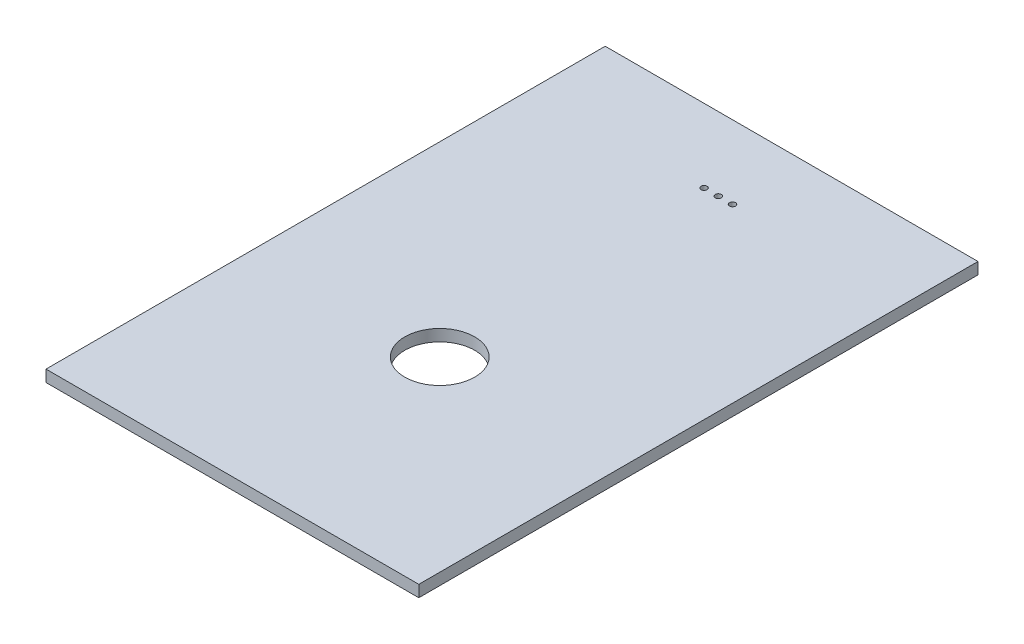
ISO-10303-21;
HEADER;
FILE_DESCRIPTION(('STEP AP214'),'2;1');
FILE_NAME('part.step','',(''),(''),'','','');
FILE_SCHEMA(('AUTOMOTIVE_DESIGN { 1 0 10303 214 1 1 1 1 }'));
ENDSEC;
DATA;
#1=APPLICATION_CONTEXT('core data for automotive mechanical design processes');
#2=APPLICATION_PROTOCOL_DEFINITION('international standard','automotive_design',2000,#1);
#3=PRODUCT_CONTEXT('',#1,'mechanical');
#4=PRODUCT('Part','Part','',(#3));
#5=PRODUCT_RELATED_PRODUCT_CATEGORY('part','',(#4));
#6=PRODUCT_DEFINITION_FORMATION('','',#4);
#7=PRODUCT_DEFINITION_CONTEXT('part definition',#1,'design');
#8=PRODUCT_DEFINITION('design','',#6,#7);
#9=PRODUCT_DEFINITION_SHAPE('','',#8);
#10=(LENGTH_UNIT() NAMED_UNIT(*) SI_UNIT(.MILLI.,.METRE.));
#11=(NAMED_UNIT(*) PLANE_ANGLE_UNIT() SI_UNIT($,.RADIAN.));
#12=(NAMED_UNIT(*) SI_UNIT($,.STERADIAN.) SOLID_ANGLE_UNIT());
#13=UNCERTAINTY_MEASURE_WITH_UNIT(LENGTH_MEASURE(1.E-05),#10,'distance_accuracy_value','');
#14=(GEOMETRIC_REPRESENTATION_CONTEXT(3) GLOBAL_UNCERTAINTY_ASSIGNED_CONTEXT((#13)) GLOBAL_UNIT_ASSIGNED_CONTEXT((#10,
#11,#12)) REPRESENTATION_CONTEXT('',''));
#15=CARTESIAN_POINT('',(0.,0.,0.));
#16=DIRECTION('',(0.,0.,1.));
#17=DIRECTION('',(1.,0.,0.));
#18=AXIS2_PLACEMENT_3D('',#15,#16,#17);
#19=CARTESIAN_POINT('',(-101.6,-3.175,152.4));
#20=DIRECTION('',(1.,0.,0.));
#21=DIRECTION('',(0.,0.,-1.));
#22=AXIS2_PLACEMENT_3D('',#19,#20,#21);
#23=PLANE('',#22);
#24=DIRECTION('',(0.,-1.,0.));
#25=VECTOR('',#24,1.);
#26=CARTESIAN_POINT('',(-101.6,-3.175,-152.4));
#27=LINE('',#26,#25);
#28=CARTESIAN_POINT('',(-101.6,3.175,-152.4));
#29=VERTEX_POINT('',#28);
#30=CARTESIAN_POINT('',(-101.6,-3.175,-152.4));
#31=VERTEX_POINT('',#30);
#32=EDGE_CURVE('E104',#29,#31,#27,.T.);
#33=ORIENTED_EDGE('',*,*,#32,.T.);
#34=DIRECTION('',(0.,0.,-1.));
#35=VECTOR('',#34,1.);
#36=CARTESIAN_POINT('',(-101.6,-3.175,152.4));
#37=LINE('',#36,#35);
#38=CARTESIAN_POINT('',(-101.6,-3.175,152.4));
#39=VERTEX_POINT('',#38);
#40=EDGE_CURVE('E11',#39,#31,#37,.T.);
#41=ORIENTED_EDGE('',*,*,#40,.F.);
#42=DIRECTION('',(0.,-1.,0.));
#43=VECTOR('',#42,1.);
#44=CARTESIAN_POINT('',(-101.6,-3.175,152.4));
#45=LINE('',#44,#43);
#46=CARTESIAN_POINT('',(-101.6,3.175,152.4));
#47=VERTEX_POINT('',#46);
#48=EDGE_CURVE('E91',#47,#39,#45,.T.);
#49=ORIENTED_EDGE('',*,*,#48,.F.);
#50=DIRECTION('',(0.,0.,-1.));
#51=VECTOR('',#50,1.);
#52=CARTESIAN_POINT('',(-101.6,3.175,152.4));
#53=LINE('',#52,#51);
#54=EDGE_CURVE('E100',#47,#29,#53,.T.);
#55=ORIENTED_EDGE('',*,*,#54,.T.);
#56=EDGE_LOOP('',(#33,#41,#49,#55));
#57=FACE_BOUND('',#56,.T.);
#58=ADVANCED_FACE('F38',(#57),#23,.F.);
#59=CARTESIAN_POINT('',(101.6,-3.175,152.4));
#60=DIRECTION('',(0.,1.,0.));
#61=DIRECTION('',(0.,0.,1.));
#62=AXIS2_PLACEMENT_3D('',#59,#60,#61);
#63=PLANE('',#62);
#64=CARTESIAN_POINT('',(0.,-3.175,39.38524));
#65=DIRECTION('',(0.,1.,0.));
#66=DIRECTION('',(0.,0.,1.));
#67=AXIS2_PLACEMENT_3D('',#64,#65,#66);
#68=CIRCLE('',#67,19.05);
#69=CARTESIAN_POINT('',(0.,-3.175,58.43524));
#70=VERTEX_POINT('',#69);
#71=EDGE_CURVE('E138',#70,#70,#68,.T.);
#72=ORIENTED_EDGE('',*,*,#71,.T.);
#73=EDGE_LOOP('',(#72));
#74=FACE_BOUND('',#73,.T.);
#75=CARTESIAN_POINT('',(7.74656669241486,-3.175,-112.45));
#76=DIRECTION('',(0.,1.,0.));
#77=DIRECTION('',(0.,0.,1.));
#78=AXIS2_PLACEMENT_3D('',#75,#76,#77);
#79=CIRCLE('',#78,3.52552);
#80=CARTESIAN_POINT('',(7.74656669241486,-3.175,-108.92448));
#81=VERTEX_POINT('',#80);
#82=EDGE_CURVE('E147',#81,#81,#79,.T.);
#83=ORIENTED_EDGE('',*,*,#82,.T.);
#84=EDGE_LOOP('',(#83));
#85=FACE_BOUND('',#84,.T.);
#86=CARTESIAN_POINT('',(0.000600000000026794,-3.175,-112.45));
#87=DIRECTION('',(0.,1.,0.));
#88=DIRECTION('',(0.,0.,1.));
#89=AXIS2_PLACEMENT_3D('',#86,#87,#88);
#90=CIRCLE('',#89,3.52552);
#91=CARTESIAN_POINT('',(0.000600000000026794,-3.175,-108.92448));
#92=VERTEX_POINT('',#91);
#93=EDGE_CURVE('E144',#92,#92,#90,.T.);
#94=ORIENTED_EDGE('',*,*,#93,.T.);
#95=EDGE_LOOP('',(#94));
#96=FACE_BOUND('',#95,.T.);
#97=CARTESIAN_POINT('',(-7.74536669241481,-3.175,-112.45));
#98=DIRECTION('',(0.,1.,0.));
#99=DIRECTION('',(0.,0.,1.));
#100=AXIS2_PLACEMENT_3D('',#97,#98,#99);
#101=CIRCLE('',#100,3.52552);
#102=CARTESIAN_POINT('',(-7.74536669241481,-3.175,-108.92448));
#103=VERTEX_POINT('',#102);
#104=EDGE_CURVE('E137',#103,#103,#101,.T.);
#105=ORIENTED_EDGE('',*,*,#104,.T.);
#106=EDGE_LOOP('',(#105));
#107=FACE_BOUND('',#106,.T.);
#108=DIRECTION('',(1.,0.,0.));
#109=VECTOR('',#108,1.);
#110=CARTESIAN_POINT('',(101.6,-3.175,-152.4));
#111=LINE('',#110,#109);
#112=CARTESIAN_POINT('',(101.6,-3.175,-152.4));
#113=VERTEX_POINT('',#112);
#114=EDGE_CURVE('E95',#31,#113,#111,.T.);
#115=ORIENTED_EDGE('',*,*,#114,.T.);
#116=DIRECTION('',(0.,0.,-1.));
#117=VECTOR('',#116,1.);
#118=CARTESIAN_POINT('',(101.6,-3.175,152.4));
#119=LINE('',#118,#117);
#120=CARTESIAN_POINT('',(101.6,-3.175,152.4));
#121=VERTEX_POINT('',#120);
#122=EDGE_CURVE('E47',#121,#113,#119,.T.);
#123=ORIENTED_EDGE('',*,*,#122,.F.);
#124=DIRECTION('',(1.,0.,0.));
#125=VECTOR('',#124,1.);
#126=CARTESIAN_POINT('',(101.6,-3.175,152.4));
#127=LINE('',#126,#125);
#128=EDGE_CURVE('E86',#39,#121,#127,.T.);
#129=ORIENTED_EDGE('',*,*,#128,.F.);
#130=ORIENTED_EDGE('',*,*,#40,.T.);
#131=EDGE_LOOP('',(#115,#123,#129,#130));
#132=FACE_BOUND('',#131,.T.);
#133=ADVANCED_FACE('F94',(#74,#85,#96,#107,#132),#63,.F.);
#134=CARTESIAN_POINT('',(101.6,3.175,152.4));
#135=DIRECTION('',(-1.,0.,0.));
#136=DIRECTION('',(0.,0.,1.));
#137=AXIS2_PLACEMENT_3D('',#134,#135,#136);
#138=PLANE('',#137);
#139=DIRECTION('',(0.,1.,0.));
#140=VECTOR('',#139,1.);
#141=CARTESIAN_POINT('',(101.6,3.175,-152.4));
#142=LINE('',#141,#140);
#143=CARTESIAN_POINT('',(101.6,3.175,-152.4));
#144=VERTEX_POINT('',#143);
#145=EDGE_CURVE('E73',#113,#144,#142,.T.);
#146=ORIENTED_EDGE('',*,*,#145,.T.);
#147=DIRECTION('',(0.,0.,-1.));
#148=VECTOR('',#147,1.);
#149=CARTESIAN_POINT('',(101.6,3.175,152.4));
#150=LINE('',#149,#148);
#151=CARTESIAN_POINT('',(101.6,3.175,152.4));
#152=VERTEX_POINT('',#151);
#153=EDGE_CURVE('E96',#152,#144,#150,.T.);
#154=ORIENTED_EDGE('',*,*,#153,.F.);
#155=DIRECTION('',(0.,1.,0.));
#156=VECTOR('',#155,1.);
#157=CARTESIAN_POINT('',(101.6,3.175,152.4));
#158=LINE('',#157,#156);
#159=EDGE_CURVE('E89',#121,#152,#158,.T.);
#160=ORIENTED_EDGE('',*,*,#159,.F.);
#161=ORIENTED_EDGE('',*,*,#122,.T.);
#162=EDGE_LOOP('',(#146,#154,#160,#161));
#163=FACE_BOUND('',#162,.T.);
#164=ADVANCED_FACE('F98',(#163),#138,.F.);
#165=CARTESIAN_POINT('',(-101.6,3.175,152.4));
#166=DIRECTION('',(0.,-1.,0.));
#167=DIRECTION('',(0.,0.,-1.));
#168=AXIS2_PLACEMENT_3D('',#165,#166,#167);
#169=PLANE('',#168);
#170=CARTESIAN_POINT('',(0.,3.175,39.38524));
#171=DIRECTION('',(0.,1.,0.));
#172=DIRECTION('',(0.,0.,1.));
#173=AXIS2_PLACEMENT_3D('',#170,#171,#172);
#174=CIRCLE('',#173,19.05);
#175=CARTESIAN_POINT('',(0.,3.175,58.43524));
#176=VERTEX_POINT('',#175);
#177=EDGE_CURVE('E152',#176,#176,#174,.T.);
#178=ORIENTED_EDGE('',*,*,#177,.F.);
#179=EDGE_LOOP('',(#178));
#180=FACE_BOUND('',#179,.T.);
#181=CARTESIAN_POINT('',(7.74656669241486,3.175,-112.45));
#182=DIRECTION('',(0.,1.,0.));
#183=DIRECTION('',(0.,0.,1.));
#184=AXIS2_PLACEMENT_3D('',#181,#182,#183);
#185=CIRCLE('',#184,1.65);
#186=CARTESIAN_POINT('',(7.74656669241486,3.17500000000237,-110.8));
#187=VERTEX_POINT('',#186);
#188=EDGE_CURVE('E107',#187,#187,#185,.T.);
#189=ORIENTED_EDGE('',*,*,#188,.F.);
#190=EDGE_LOOP('',(#189));
#191=FACE_BOUND('',#190,.T.);
#192=CARTESIAN_POINT('',(-7.74536669241481,3.175,-112.45));
#193=DIRECTION('',(0.,1.,0.));
#194=DIRECTION('',(0.,0.,1.));
#195=AXIS2_PLACEMENT_3D('',#192,#193,#194);
#196=CIRCLE('',#195,1.650000002);
#197=CARTESIAN_POINT('',(-7.74536669241481,3.17500000000237,-110.799999998));
#198=VERTEX_POINT('',#197);
#199=EDGE_CURVE('E125',#198,#198,#196,.T.);
#200=ORIENTED_EDGE('',*,*,#199,.F.);
#201=EDGE_LOOP('',(#200));
#202=FACE_BOUND('',#201,.T.);
#203=CARTESIAN_POINT('',(0.000600000000026794,3.175,-112.45));
#204=DIRECTION('',(0.,1.,0.));
#205=DIRECTION('',(0.,0.,1.));
#206=AXIS2_PLACEMENT_3D('',#203,#204,#205);
#207=CIRCLE('',#206,1.65);
#208=CARTESIAN_POINT('',(0.000600000000026794,3.17500000000237,-110.8));
#209=VERTEX_POINT('',#208);
#210=EDGE_CURVE('E121',#209,#209,#207,.T.);
#211=ORIENTED_EDGE('',*,*,#210,.F.);
#212=EDGE_LOOP('',(#211));
#213=FACE_BOUND('',#212,.T.);
#214=DIRECTION('',(-1.,0.,0.));
#215=VECTOR('',#214,1.);
#216=CARTESIAN_POINT('',(-101.6,3.175,-152.4));
#217=LINE('',#216,#215);
#218=EDGE_CURVE('E79',#144,#29,#217,.T.);
#219=ORIENTED_EDGE('',*,*,#218,.T.);
#220=ORIENTED_EDGE('',*,*,#54,.F.);
#221=DIRECTION('',(-1.,0.,0.));
#222=VECTOR('',#221,1.);
#223=CARTESIAN_POINT('',(-101.6,3.175,152.4));
#224=LINE('',#223,#222);
#225=EDGE_CURVE('E56',#152,#47,#224,.T.);
#226=ORIENTED_EDGE('',*,*,#225,.F.);
#227=ORIENTED_EDGE('',*,*,#153,.T.);
#228=EDGE_LOOP('',(#219,#220,#226,#227));
#229=FACE_BOUND('',#228,.T.);
#230=ADVANCED_FACE('F167',(#180,#191,#202,#213,#229),#169,.F.);
#231=CARTESIAN_POINT('',(0.,0.,152.4));
#232=DIRECTION('',(0.,0.,-1.));
#233=DIRECTION('',(-1.,0.,0.));
#234=AXIS2_PLACEMENT_3D('',#231,#232,#233);
#235=PLANE('',#234);
#236=ORIENTED_EDGE('',*,*,#48,.T.);
#237=ORIENTED_EDGE('',*,*,#128,.T.);
#238=ORIENTED_EDGE('',*,*,#159,.T.);
#239=ORIENTED_EDGE('',*,*,#225,.T.);
#240=EDGE_LOOP('',(#236,#237,#238,#239));
#241=FACE_BOUND('',#240,.T.);
#242=ADVANCED_FACE('F87',(#241),#235,.F.);
#243=CARTESIAN_POINT('',(0.,0.,-152.4));
#244=DIRECTION('',(0.,0.,-1.));
#245=DIRECTION('',(-1.,0.,0.));
#246=AXIS2_PLACEMENT_3D('',#243,#244,#245);
#247=PLANE('',#246);
#248=ORIENTED_EDGE('',*,*,#32,.F.);
#249=ORIENTED_EDGE('',*,*,#218,.F.);
#250=ORIENTED_EDGE('',*,*,#145,.F.);
#251=ORIENTED_EDGE('',*,*,#114,.F.);
#252=EDGE_LOOP('',(#248,#249,#250,#251));
#253=FACE_BOUND('',#252,.T.);
#254=ADVANCED_FACE('F188',(#253),#247,.T.);
#255=CARTESIAN_POINT('',(0.000600000000026794,-25396.825,-112.45));
#256=DIRECTION('',(0.,1.,0.));
#257=DIRECTION('',(0.,0.,1.));
#258=AXIS2_PLACEMENT_3D('',#255,#256,#257);
#259=CYLINDRICAL_SURFACE('',#258,1.65);
#260=CARTESIAN_POINT('',(0.000600000000026794,-0.375919999999752,-112.45));
#261=DIRECTION('',(0.,1.,0.));
#262=DIRECTION('',(0.,0.,1.));
#263=AXIS2_PLACEMENT_3D('',#260,#261,#262);
#264=CIRCLE('',#263,1.65);
#265=CARTESIAN_POINT('',(0.000600000000026794,-0.375919999999752,-110.8));
#266=VERTEX_POINT('',#265);
#267=EDGE_CURVE('E41',#266,#266,#264,.F.);
#268=CARTESIAN_POINT('',(0.000600000000026794,-0.375919999999752,-110.8));
#269=CARTESIAN_POINT('',(0.000600000000026794,-0.338931250000248,-110.8));
#270=CARTESIAN_POINT('',(0.000600000000026794,-0.301942500000744,-110.8));
#271=CARTESIAN_POINT('',(0.000600000000026794,-0.227965000000552,-110.8));
#272=CARTESIAN_POINT('',(0.000600000000026794,-0.190976249999864,-110.8));
#273=CARTESIAN_POINT('',(0.000600000000026794,-0.116998749999671,-110.8));
#274=CARTESIAN_POINT('',(0.000600000000026794,-0.0800100000001673,-110.8));
#275=CARTESIAN_POINT('',(0.000600000000026794,-0.00603249999997502,-110.8));
#276=CARTESIAN_POINT('',(0.000600000000026794,0.0309562500007132,-110.8));
#277=CARTESIAN_POINT('',(0.000600000000026794,0.104933750000905,-110.8));
#278=CARTESIAN_POINT('',(0.000600000000026794,0.141922500000409,-110.8));
#279=CARTESIAN_POINT('',(0.000600000000026794,0.215900000000602,-110.8));
#280=CARTESIAN_POINT('',(0.000600000000026794,0.25288875000129,-110.8));
#281=CARTESIAN_POINT('',(0.000600000000026794,0.326866250001482,-110.8));
#282=CARTESIAN_POINT('',(0.000600000000026794,0.363855000000986,-110.8));
#283=CARTESIAN_POINT('',(0.000600000000026794,0.437832500001178,-110.8));
#284=CARTESIAN_POINT('',(0.000600000000026794,0.474821250001867,-110.8));
#285=CARTESIAN_POINT('',(0.000600000000026794,0.548798750002059,-110.8));
#286=CARTESIAN_POINT('',(0.000600000000026794,0.585787500001563,-110.8));
#287=CARTESIAN_POINT('',(0.000600000000026794,0.659765000000571,-110.8));
#288=CARTESIAN_POINT('',(0.000600000000026794,0.696753750000075,-110.8));
#289=CARTESIAN_POINT('',(0.000600000000026794,0.770731250000267,-110.8));
#290=CARTESIAN_POINT('',(0.000600000000026794,0.807720000000955,-110.8));
#291=CARTESIAN_POINT('',(0.000600000000026794,0.881697500001148,-110.8));
#292=CARTESIAN_POINT('',(0.000600000000026794,0.918686250000652,-110.8));
#293=CARTESIAN_POINT('',(0.000600000000026794,0.992663750000844,-110.8));
#294=CARTESIAN_POINT('',(0.000600000000026794,1.02965250000153,-110.8));
#295=CARTESIAN_POINT('',(0.000600000000026794,1.10363000000172,-110.8));
#296=CARTESIAN_POINT('',(0.000600000000026794,1.14061875000123,-110.8));
#297=CARTESIAN_POINT('',(0.000600000000026794,1.21459625000142,-110.8));
#298=CARTESIAN_POINT('',(0.000600000000026794,1.25158500000211,-110.8));
#299=CARTESIAN_POINT('',(0.000600000000026794,1.3255625000023,-110.8));
#300=CARTESIAN_POINT('',(0.000600000000026794,1.36255125000181,-110.8));
#301=CARTESIAN_POINT('',(0.000600000000026794,1.43652875000081,-110.8));
#302=CARTESIAN_POINT('',(0.000600000000026794,1.47351750000032,-110.8));
#303=CARTESIAN_POINT('',(0.000600000000026794,1.54749500000051,-110.8));
#304=CARTESIAN_POINT('',(0.000600000000026794,1.5844837500012,-110.8));
#305=CARTESIAN_POINT('',(0.000600000000026794,1.65846125000139,-110.8));
#306=CARTESIAN_POINT('',(0.000600000000026794,1.69545000000089,-110.8));
#307=CARTESIAN_POINT('',(0.000600000000026794,1.76942750000109,-110.8));
#308=CARTESIAN_POINT('',(0.000600000000026794,1.80641625000177,-110.8));
#309=CARTESIAN_POINT('',(0.000600000000026794,1.88039375000197,-110.8));
#310=CARTESIAN_POINT('',(0.000600000000026794,1.91738250000147,-110.8));
#311=CARTESIAN_POINT('',(0.000600000000026794,1.99136000000166,-110.8));
#312=CARTESIAN_POINT('',(0.000600000000026794,2.02834875000235,-110.8));
#313=CARTESIAN_POINT('',(0.000600000000026794,2.10232625000254,-110.8));
#314=CARTESIAN_POINT('',(0.000600000000026794,2.13931500000205,-110.8));
#315=CARTESIAN_POINT('',(0.000600000000026794,2.21329250000106,-110.8));
#316=CARTESIAN_POINT('',(0.000600000000026794,2.25028125000056,-110.8));
#317=CARTESIAN_POINT('',(0.000600000000026794,2.32425875000075,-110.8));
#318=CARTESIAN_POINT('',(0.000600000000026794,2.36124750000144,-110.8));
#319=CARTESIAN_POINT('',(0.000600000000026794,2.43522500000163,-110.8));
#320=CARTESIAN_POINT('',(0.000600000000026794,2.47221375000114,-110.8));
#321=CARTESIAN_POINT('',(0.000600000000026794,2.54619125000133,-110.8));
#322=CARTESIAN_POINT('',(0.000600000000026794,2.58318000000202,-110.8));
#323=CARTESIAN_POINT('',(0.000600000000026794,2.65715750000221,-110.8));
#324=CARTESIAN_POINT('',(0.000600000000026794,2.69414625000171,-110.8));
#325=CARTESIAN_POINT('',(0.000600000000026794,2.76812375000191,-110.8));
#326=CARTESIAN_POINT('',(0.000600000000026794,2.80511250000259,-110.8));
#327=CARTESIAN_POINT('',(0.000600000000026794,2.87909000000279,-110.8));
#328=CARTESIAN_POINT('',(0.000600000000026794,2.91607875000229,-110.8));
#329=CARTESIAN_POINT('',(0.000600000000026794,2.99005625000248,-110.8));
#330=CARTESIAN_POINT('',(0.000600000000026794,3.02704500000317,-110.8));
#331=CARTESIAN_POINT('',(0.000600000000026794,3.10102250000336,-110.8));
#332=CARTESIAN_POINT('',(0.000600000000026794,3.13801125000287,-110.8));
#333=CARTESIAN_POINT('',(0.000600000000026794,3.17500000000237,-110.8));
#334=B_SPLINE_CURVE_WITH_KNOTS('',3,(#268,#269,#270,#271,#272,#273,#274,#275,#276,#277,#278,
#279,#280,#281,#282,#283,#284,#285,#286,#287,#288,#289,#290,#291,#292,#293,#294,#295,#296,#297,
#298,#299,#300,#301,#302,#303,#304,#305,#306,#307,#308,#309,#310,#311,#312,#313,#314,#315,#316,
#317,#318,#319,#320,#321,#322,#323,#324,#325,#326,#327,#328,#329,#330,#331,#332,#333),
.UNSPECIFIED.,.F.,.F.,(4,2,2,2,2,2,2,2,2,2,2,2,2,2,2,2,2,2,2,2,2,2,2,2,2,2,2,2,2,2,2,2,4),(0.,
0.110966249998512,0.221932500000577,0.332898749999089,0.443865000001153,0.554831249999665,
0.66579750000173,0.776763750000242,0.887730000002307,0.998696250000819,1.10966249999933,
1.2206287500014,1.33159499999991,1.44256125000197,1.55352750000048,1.66449375000255,
1.77546000000106,1.88642624999957,1.99739250000164,2.10835875000015,2.21932500000221,
2.33029125000073,2.44125750000279,2.5522237500013,2.66318999999982,2.77415625000188,
2.88512250000039,2.99608875000246,3.10705500000097,3.21802125000303,3.32898750000155,
3.43995375000361,3.55092000000212),.UNSPECIFIED.);
#335=EDGE_CURVE('BSEAM179',#266,#209,#334,.T.);
#336=ORIENTED_EDGE('',*,*,#267,.T.);
#337=ORIENTED_EDGE('',*,*,#210,.T.);
#338=ORIENTED_EDGE('',*,*,#335,.T.);
#339=ORIENTED_EDGE('',*,*,#335,.F.);
#340=EDGE_LOOP('',(#336,#338,#337,#339));
#341=FACE_BOUND('',#340,.T.);
#342=ADVANCED_FACE('F179',(#341),#259,.F.);
#343=CARTESIAN_POINT('',(-7.74536669241481,-25396.825,-112.45));
#344=DIRECTION('',(0.,1.,0.));
#345=DIRECTION('',(0.,0.,1.));
#346=AXIS2_PLACEMENT_3D('',#343,#344,#345);
#347=CYLINDRICAL_SURFACE('',#346,1.650000002);
#348=CARTESIAN_POINT('',(-7.74536669241481,-0.375919999999752,-112.45));
#349=DIRECTION('',(0.,1.,0.));
#350=DIRECTION('',(0.,0.,1.));
#351=AXIS2_PLACEMENT_3D('',#348,#349,#350);
#352=CIRCLE('',#351,1.650000002);
#353=CARTESIAN_POINT('',(-7.74536669241481,-0.375919999999752,-110.799999998));
#354=VERTEX_POINT('',#353);
#355=EDGE_CURVE('E115',#354,#354,#352,.F.);
#356=CARTESIAN_POINT('',(-7.74536669241481,-0.375919999999752,-110.799999998));
#357=CARTESIAN_POINT('',(-7.74536669241481,-0.338931250000248,-110.799999998));
#358=CARTESIAN_POINT('',(-7.74536669241481,-0.301942500000744,-110.799999998));
#359=CARTESIAN_POINT('',(-7.74536669241481,-0.227965000000552,-110.799999998));
#360=CARTESIAN_POINT('',(-7.74536669241481,-0.190976249999864,-110.799999998));
#361=CARTESIAN_POINT('',(-7.74536669241481,-0.116998749999671,-110.799999998));
#362=CARTESIAN_POINT('',(-7.74536669241481,-0.0800100000001673,-110.799999998));
#363=CARTESIAN_POINT('',(-7.74536669241481,-0.00603249999997502,-110.799999998));
#364=CARTESIAN_POINT('',(-7.74536669241481,0.0309562500007132,-110.799999998));
#365=CARTESIAN_POINT('',(-7.74536669241481,0.104933750000905,-110.799999998));
#366=CARTESIAN_POINT('',(-7.74536669241481,0.141922500000409,-110.799999998));
#367=CARTESIAN_POINT('',(-7.74536669241481,0.215900000000602,-110.799999998));
#368=CARTESIAN_POINT('',(-7.74536669241481,0.25288875000129,-110.799999998));
#369=CARTESIAN_POINT('',(-7.74536669241481,0.326866250001482,-110.799999998));
#370=CARTESIAN_POINT('',(-7.74536669241481,0.363855000000986,-110.799999998));
#371=CARTESIAN_POINT('',(-7.74536669241481,0.437832500001178,-110.799999998));
#372=CARTESIAN_POINT('',(-7.74536669241481,0.474821250001867,-110.799999998));
#373=CARTESIAN_POINT('',(-7.74536669241481,0.548798750002059,-110.799999998));
#374=CARTESIAN_POINT('',(-7.74536669241481,0.585787500001563,-110.799999998));
#375=CARTESIAN_POINT('',(-7.74536669241481,0.659765000000571,-110.799999998));
#376=CARTESIAN_POINT('',(-7.74536669241481,0.696753750000075,-110.799999998));
#377=CARTESIAN_POINT('',(-7.74536669241481,0.770731250000267,-110.799999998));
#378=CARTESIAN_POINT('',(-7.74536669241481,0.807720000000955,-110.799999998));
#379=CARTESIAN_POINT('',(-7.74536669241481,0.881697500001148,-110.799999998));
#380=CARTESIAN_POINT('',(-7.74536669241481,0.918686250000652,-110.799999998));
#381=CARTESIAN_POINT('',(-7.74536669241481,0.992663750000844,-110.799999998));
#382=CARTESIAN_POINT('',(-7.74536669241481,1.02965250000153,-110.799999998));
#383=CARTESIAN_POINT('',(-7.74536669241481,1.10363000000172,-110.799999998));
#384=CARTESIAN_POINT('',(-7.74536669241481,1.14061875000123,-110.799999998));
#385=CARTESIAN_POINT('',(-7.74536669241481,1.21459625000142,-110.799999998));
#386=CARTESIAN_POINT('',(-7.74536669241481,1.25158500000211,-110.799999998));
#387=CARTESIAN_POINT('',(-7.74536669241481,1.3255625000023,-110.799999998));
#388=CARTESIAN_POINT('',(-7.74536669241481,1.36255125000181,-110.799999998));
#389=CARTESIAN_POINT('',(-7.74536669241481,1.43652875000081,-110.799999998));
#390=CARTESIAN_POINT('',(-7.74536669241481,1.47351750000032,-110.799999998));
#391=CARTESIAN_POINT('',(-7.74536669241481,1.54749500000051,-110.799999998));
#392=CARTESIAN_POINT('',(-7.74536669241481,1.5844837500012,-110.799999998));
#393=CARTESIAN_POINT('',(-7.74536669241481,1.65846125000139,-110.799999998));
#394=CARTESIAN_POINT('',(-7.74536669241481,1.69545000000089,-110.799999998));
#395=CARTESIAN_POINT('',(-7.74536669241481,1.76942750000109,-110.799999998));
#396=CARTESIAN_POINT('',(-7.74536669241481,1.80641625000177,-110.799999998));
#397=CARTESIAN_POINT('',(-7.74536669241481,1.88039375000197,-110.799999998));
#398=CARTESIAN_POINT('',(-7.74536669241481,1.91738250000147,-110.799999998));
#399=CARTESIAN_POINT('',(-7.74536669241481,1.99136000000166,-110.799999998));
#400=CARTESIAN_POINT('',(-7.74536669241481,2.02834875000235,-110.799999998));
#401=CARTESIAN_POINT('',(-7.74536669241481,2.10232625000254,-110.799999998));
#402=CARTESIAN_POINT('',(-7.74536669241481,2.13931500000205,-110.799999998));
#403=CARTESIAN_POINT('',(-7.74536669241481,2.21329250000106,-110.799999998));
#404=CARTESIAN_POINT('',(-7.74536669241481,2.25028125000056,-110.799999998));
#405=CARTESIAN_POINT('',(-7.74536669241481,2.32425875000075,-110.799999998));
#406=CARTESIAN_POINT('',(-7.74536669241481,2.36124750000144,-110.799999998));
#407=CARTESIAN_POINT('',(-7.74536669241481,2.43522500000163,-110.799999998));
#408=CARTESIAN_POINT('',(-7.74536669241481,2.47221375000114,-110.799999998));
#409=CARTESIAN_POINT('',(-7.74536669241481,2.54619125000133,-110.799999998));
#410=CARTESIAN_POINT('',(-7.74536669241481,2.58318000000202,-110.799999998));
#411=CARTESIAN_POINT('',(-7.74536669241481,2.65715750000221,-110.799999998));
#412=CARTESIAN_POINT('',(-7.74536669241481,2.69414625000171,-110.799999998));
#413=CARTESIAN_POINT('',(-7.74536669241481,2.76812375000191,-110.799999998));
#414=CARTESIAN_POINT('',(-7.74536669241481,2.80511250000259,-110.799999998));
#415=CARTESIAN_POINT('',(-7.74536669241481,2.87909000000279,-110.799999998));
#416=CARTESIAN_POINT('',(-7.74536669241481,2.91607875000229,-110.799999998));
#417=CARTESIAN_POINT('',(-7.74536669241481,2.99005625000248,-110.799999998));
#418=CARTESIAN_POINT('',(-7.74536669241481,3.02704500000317,-110.799999998));
#419=CARTESIAN_POINT('',(-7.74536669241481,3.10102250000336,-110.799999998));
#420=CARTESIAN_POINT('',(-7.74536669241481,3.13801125000287,-110.799999998));
#421=CARTESIAN_POINT('',(-7.74536669241481,3.17500000000237,-110.799999998));
#422=B_SPLINE_CURVE_WITH_KNOTS('',3,(#356,#357,#358,#359,#360,#361,#362,#363,#364,#365,#366,
#367,#368,#369,#370,#371,#372,#373,#374,#375,#376,#377,#378,#379,#380,#381,#382,#383,#384,#385,
#386,#387,#388,#389,#390,#391,#392,#393,#394,#395,#396,#397,#398,#399,#400,#401,#402,#403,#404,
#405,#406,#407,#408,#409,#410,#411,#412,#413,#414,#415,#416,#417,#418,#419,#420,#421),
.UNSPECIFIED.,.F.,.F.,(4,2,2,2,2,2,2,2,2,2,2,2,2,2,2,2,2,2,2,2,2,2,2,2,2,2,2,2,2,2,2,2,4),(0.,
0.110966249998512,0.221932500000577,0.332898749999089,0.443865000001153,0.554831249999665,
0.66579750000173,0.776763750000242,0.887730000002307,0.998696250000819,1.10966249999933,
1.2206287500014,1.33159499999991,1.44256125000197,1.55352750000048,1.66449375000255,
1.77546000000106,1.88642624999957,1.99739250000164,2.10835875000015,2.21932500000221,
2.33029125000073,2.44125750000279,2.5522237500013,2.66318999999982,2.77415625000188,
2.88512250000039,2.99608875000246,3.10705500000097,3.21802125000303,3.32898750000155,
3.43995375000361,3.55092000000212),.UNSPECIFIED.);
#423=EDGE_CURVE('BSEAM176',#354,#198,#422,.T.);
#424=ORIENTED_EDGE('',*,*,#355,.T.);
#425=ORIENTED_EDGE('',*,*,#199,.T.);
#426=ORIENTED_EDGE('',*,*,#423,.T.);
#427=ORIENTED_EDGE('',*,*,#423,.F.);
#428=EDGE_LOOP('',(#424,#426,#425,#427));
#429=FACE_BOUND('',#428,.T.);
#430=ADVANCED_FACE('F176',(#429),#347,.F.);
#431=CARTESIAN_POINT('',(7.74656669241486,-25396.825,-112.45));
#432=DIRECTION('',(0.,1.,0.));
#433=DIRECTION('',(0.,0.,1.));
#434=AXIS2_PLACEMENT_3D('',#431,#432,#433);
#435=CYLINDRICAL_SURFACE('',#434,1.65);
#436=CARTESIAN_POINT('',(7.74656669241486,-0.375919999999752,-112.45));
#437=DIRECTION('',(0.,1.,0.));
#438=DIRECTION('',(0.,0.,1.));
#439=AXIS2_PLACEMENT_3D('',#436,#437,#438);
#440=CIRCLE('',#439,1.65);
#441=CARTESIAN_POINT('',(7.74656669241486,-0.375919999999752,-110.8));
#442=VERTEX_POINT('',#441);
#443=EDGE_CURVE('E113',#442,#442,#440,.F.);
#444=CARTESIAN_POINT('',(7.74656669241486,-0.375919999999752,-110.8));
#445=CARTESIAN_POINT('',(7.74656669241486,-0.338931250000248,-110.8));
#446=CARTESIAN_POINT('',(7.74656669241486,-0.301942500000744,-110.8));
#447=CARTESIAN_POINT('',(7.74656669241486,-0.227965000000552,-110.8));
#448=CARTESIAN_POINT('',(7.74656669241486,-0.190976249999864,-110.8));
#449=CARTESIAN_POINT('',(7.74656669241486,-0.116998749999671,-110.8));
#450=CARTESIAN_POINT('',(7.74656669241486,-0.0800100000001673,-110.8));
#451=CARTESIAN_POINT('',(7.74656669241486,-0.00603249999997502,-110.8));
#452=CARTESIAN_POINT('',(7.74656669241486,0.0309562500007132,-110.8));
#453=CARTESIAN_POINT('',(7.74656669241486,0.104933750000905,-110.8));
#454=CARTESIAN_POINT('',(7.74656669241486,0.141922500000409,-110.8));
#455=CARTESIAN_POINT('',(7.74656669241486,0.215900000000602,-110.8));
#456=CARTESIAN_POINT('',(7.74656669241486,0.25288875000129,-110.8));
#457=CARTESIAN_POINT('',(7.74656669241486,0.326866250001482,-110.8));
#458=CARTESIAN_POINT('',(7.74656669241486,0.363855000000986,-110.8));
#459=CARTESIAN_POINT('',(7.74656669241486,0.437832500001178,-110.8));
#460=CARTESIAN_POINT('',(7.74656669241486,0.474821250001867,-110.8));
#461=CARTESIAN_POINT('',(7.74656669241486,0.548798750002059,-110.8));
#462=CARTESIAN_POINT('',(7.74656669241486,0.585787500001563,-110.8));
#463=CARTESIAN_POINT('',(7.74656669241486,0.659765000000571,-110.8));
#464=CARTESIAN_POINT('',(7.74656669241486,0.696753750000075,-110.8));
#465=CARTESIAN_POINT('',(7.74656669241486,0.770731250000267,-110.8));
#466=CARTESIAN_POINT('',(7.74656669241486,0.807720000000955,-110.8));
#467=CARTESIAN_POINT('',(7.74656669241486,0.881697500001148,-110.8));
#468=CARTESIAN_POINT('',(7.74656669241486,0.918686250000652,-110.8));
#469=CARTESIAN_POINT('',(7.74656669241486,0.992663750000844,-110.8));
#470=CARTESIAN_POINT('',(7.74656669241486,1.02965250000153,-110.8));
#471=CARTESIAN_POINT('',(7.74656669241486,1.10363000000172,-110.8));
#472=CARTESIAN_POINT('',(7.74656669241486,1.14061875000123,-110.8));
#473=CARTESIAN_POINT('',(7.74656669241486,1.21459625000142,-110.8));
#474=CARTESIAN_POINT('',(7.74656669241486,1.25158500000211,-110.8));
#475=CARTESIAN_POINT('',(7.74656669241486,1.3255625000023,-110.8));
#476=CARTESIAN_POINT('',(7.74656669241486,1.36255125000181,-110.8));
#477=CARTESIAN_POINT('',(7.74656669241486,1.43652875000081,-110.8));
#478=CARTESIAN_POINT('',(7.74656669241486,1.47351750000032,-110.8));
#479=CARTESIAN_POINT('',(7.74656669241486,1.54749500000051,-110.8));
#480=CARTESIAN_POINT('',(7.74656669241486,1.5844837500012,-110.8));
#481=CARTESIAN_POINT('',(7.74656669241486,1.65846125000139,-110.8));
#482=CARTESIAN_POINT('',(7.74656669241486,1.69545000000089,-110.8));
#483=CARTESIAN_POINT('',(7.74656669241486,1.76942750000109,-110.8));
#484=CARTESIAN_POINT('',(7.74656669241486,1.80641625000177,-110.8));
#485=CARTESIAN_POINT('',(7.74656669241486,1.88039375000197,-110.8));
#486=CARTESIAN_POINT('',(7.74656669241486,1.91738250000147,-110.8));
#487=CARTESIAN_POINT('',(7.74656669241486,1.99136000000166,-110.8));
#488=CARTESIAN_POINT('',(7.74656669241486,2.02834875000235,-110.8));
#489=CARTESIAN_POINT('',(7.74656669241486,2.10232625000254,-110.8));
#490=CARTESIAN_POINT('',(7.74656669241486,2.13931500000205,-110.8));
#491=CARTESIAN_POINT('',(7.74656669241486,2.21329250000106,-110.8));
#492=CARTESIAN_POINT('',(7.74656669241486,2.25028125000056,-110.8));
#493=CARTESIAN_POINT('',(7.74656669241486,2.32425875000075,-110.8));
#494=CARTESIAN_POINT('',(7.74656669241486,2.36124750000144,-110.8));
#495=CARTESIAN_POINT('',(7.74656669241486,2.43522500000163,-110.8));
#496=CARTESIAN_POINT('',(7.74656669241486,2.47221375000114,-110.8));
#497=CARTESIAN_POINT('',(7.74656669241486,2.54619125000133,-110.8));
#498=CARTESIAN_POINT('',(7.74656669241486,2.58318000000202,-110.8));
#499=CARTESIAN_POINT('',(7.74656669241486,2.65715750000221,-110.8));
#500=CARTESIAN_POINT('',(7.74656669241486,2.69414625000171,-110.8));
#501=CARTESIAN_POINT('',(7.74656669241486,2.76812375000191,-110.8));
#502=CARTESIAN_POINT('',(7.74656669241486,2.80511250000259,-110.8));
#503=CARTESIAN_POINT('',(7.74656669241486,2.87909000000279,-110.8));
#504=CARTESIAN_POINT('',(7.74656669241486,2.91607875000229,-110.8));
#505=CARTESIAN_POINT('',(7.74656669241486,2.99005625000248,-110.8));
#506=CARTESIAN_POINT('',(7.74656669241486,3.02704500000317,-110.8));
#507=CARTESIAN_POINT('',(7.74656669241486,3.10102250000336,-110.8));
#508=CARTESIAN_POINT('',(7.74656669241486,3.13801125000287,-110.8));
#509=CARTESIAN_POINT('',(7.74656669241486,3.17500000000237,-110.8));
#510=B_SPLINE_CURVE_WITH_KNOTS('',3,(#444,#445,#446,#447,#448,#449,#450,#451,#452,#453,#454,
#455,#456,#457,#458,#459,#460,#461,#462,#463,#464,#465,#466,#467,#468,#469,#470,#471,#472,#473,
#474,#475,#476,#477,#478,#479,#480,#481,#482,#483,#484,#485,#486,#487,#488,#489,#490,#491,#492,
#493,#494,#495,#496,#497,#498,#499,#500,#501,#502,#503,#504,#505,#506,#507,#508,#509),
.UNSPECIFIED.,.F.,.F.,(4,2,2,2,2,2,2,2,2,2,2,2,2,2,2,2,2,2,2,2,2,2,2,2,2,2,2,2,2,2,2,2,4),(0.,
0.110966249998512,0.221932500000577,0.332898749999089,0.443865000001153,0.554831249999665,
0.66579750000173,0.776763750000242,0.887730000002307,0.998696250000819,1.10966249999933,
1.2206287500014,1.33159499999991,1.44256125000197,1.55352750000048,1.66449375000255,
1.77546000000106,1.88642624999957,1.99739250000164,2.10835875000015,2.21932500000221,
2.33029125000073,2.44125750000279,2.5522237500013,2.66318999999982,2.77415625000188,
2.88512250000039,2.99608875000246,3.10705500000097,3.21802125000303,3.32898750000155,
3.43995375000361,3.55092000000212),.UNSPECIFIED.);
#511=EDGE_CURVE('BSEAM178',#442,#187,#510,.T.);
#512=ORIENTED_EDGE('',*,*,#443,.T.);
#513=ORIENTED_EDGE('',*,*,#188,.T.);
#514=ORIENTED_EDGE('',*,*,#511,.T.);
#515=ORIENTED_EDGE('',*,*,#511,.F.);
#516=EDGE_LOOP('',(#512,#514,#513,#515));
#517=FACE_BOUND('',#516,.T.);
#518=ADVANCED_FACE('F178',(#517),#435,.F.);
#519=CARTESIAN_POINT('',(7.74656669241486,-0.375920000000001,-112.45));
#520=DIRECTION('',(0.,1.,0.));
#521=DIRECTION('',(0.,0.,1.));
#522=AXIS2_PLACEMENT_3D('',#519,#520,#521);
#523=PLANE('',#522);
#524=CARTESIAN_POINT('',(7.74656669241486,-0.375920000000001,-112.45));
#525=DIRECTION('',(0.,1.,0.));
#526=DIRECTION('',(0.,0.,1.));
#527=AXIS2_PLACEMENT_3D('',#524,#525,#526);
#528=CIRCLE('',#527,3.52552);
#529=CARTESIAN_POINT('',(7.74656669241486,-0.375920000000001,-108.92448));
#530=VERTEX_POINT('',#529);
#531=EDGE_CURVE('E116',#530,#530,#528,.T.);
#532=ORIENTED_EDGE('',*,*,#531,.F.);
#533=EDGE_LOOP('',(#532));
#534=FACE_BOUND('',#533,.T.);
#535=ORIENTED_EDGE('',*,*,#443,.F.);
#536=EDGE_LOOP('',(#535));
#537=FACE_BOUND('',#536,.T.);
#538=ADVANCED_FACE('F185',(#534,#537),#523,.F.);
#539=CARTESIAN_POINT('',(7.74656669241486,-0.375920000000001,-112.45));
#540=DIRECTION('',(0.,-1.,0.));
#541=DIRECTION('',(0.,0.,-1.));
#542=AXIS2_PLACEMENT_3D('',#539,#540,#541);
#543=CYLINDRICAL_SURFACE('',#542,3.52552);
#544=ORIENTED_EDGE('',*,*,#531,.T.);
#545=EDGE_LOOP('',(#544));
#546=FACE_BOUND('',#545,.T.);
#547=ORIENTED_EDGE('',*,*,#82,.F.);
#548=EDGE_LOOP('',(#547));
#549=FACE_BOUND('',#548,.T.);
#550=ADVANCED_FACE('F250',(#546,#549),#543,.F.);
#551=CARTESIAN_POINT('',(-7.74536669241481,-0.375920000000001,-112.45));
#552=DIRECTION('',(0.,1.,0.));
#553=DIRECTION('',(0.,0.,1.));
#554=AXIS2_PLACEMENT_3D('',#551,#552,#553);
#555=PLANE('',#554);
#556=CARTESIAN_POINT('',(-7.74536669241481,-0.375920000000001,-112.45));
#557=DIRECTION('',(0.,1.,0.));
#558=DIRECTION('',(0.,0.,1.));
#559=AXIS2_PLACEMENT_3D('',#556,#557,#558);
#560=CIRCLE('',#559,3.52552);
#561=CARTESIAN_POINT('',(-7.74536669241481,-0.375920000000001,-108.92448));
#562=VERTEX_POINT('',#561);
#563=EDGE_CURVE('E134',#562,#562,#560,.T.);
#564=ORIENTED_EDGE('',*,*,#563,.F.);
#565=EDGE_LOOP('',(#564));
#566=FACE_BOUND('',#565,.T.);
#567=ORIENTED_EDGE('',*,*,#355,.F.);
#568=EDGE_LOOP('',(#567));
#569=FACE_BOUND('',#568,.T.);
#570=ADVANCED_FACE('F261',(#566,#569),#555,.F.);
#571=CARTESIAN_POINT('',(-7.74536669241481,-0.375920000000001,-112.45));
#572=DIRECTION('',(0.,-1.,0.));
#573=DIRECTION('',(0.,0.,-1.));
#574=AXIS2_PLACEMENT_3D('',#571,#572,#573);
#575=CYLINDRICAL_SURFACE('',#574,3.52552);
#576=ORIENTED_EDGE('',*,*,#563,.T.);
#577=EDGE_LOOP('',(#576));
#578=FACE_BOUND('',#577,.T.);
#579=ORIENTED_EDGE('',*,*,#104,.F.);
#580=EDGE_LOOP('',(#579));
#581=FACE_BOUND('',#580,.T.);
#582=ADVANCED_FACE('F272',(#578,#581),#575,.F.);
#583=CARTESIAN_POINT('',(0.000600000000026794,-0.375920000000001,-112.45));
#584=DIRECTION('',(0.,1.,0.));
#585=DIRECTION('',(0.,0.,1.));
#586=AXIS2_PLACEMENT_3D('',#583,#584,#585);
#587=PLANE('',#586);
#588=CARTESIAN_POINT('',(0.000600000000026794,-0.375920000000001,-112.45));
#589=DIRECTION('',(0.,1.,0.));
#590=DIRECTION('',(0.,0.,1.));
#591=AXIS2_PLACEMENT_3D('',#588,#589,#590);
#592=CIRCLE('',#591,3.52552);
#593=CARTESIAN_POINT('',(0.000600000000026794,-0.375920000000001,-108.92448));
#594=VERTEX_POINT('',#593);
#595=EDGE_CURVE('E141',#594,#594,#592,.T.);
#596=ORIENTED_EDGE('',*,*,#595,.F.);
#597=EDGE_LOOP('',(#596));
#598=FACE_BOUND('',#597,.T.);
#599=ORIENTED_EDGE('',*,*,#267,.F.);
#600=EDGE_LOOP('',(#599));
#601=FACE_BOUND('',#600,.T.);
#602=ADVANCED_FACE('F283',(#598,#601),#587,.F.);
#603=CARTESIAN_POINT('',(0.000600000000026794,-0.375920000000001,-112.45));
#604=DIRECTION('',(0.,-1.,0.));
#605=DIRECTION('',(0.,0.,-1.));
#606=AXIS2_PLACEMENT_3D('',#603,#604,#605);
#607=CYLINDRICAL_SURFACE('',#606,3.52552);
#608=ORIENTED_EDGE('',*,*,#595,.T.);
#609=EDGE_LOOP('',(#608));
#610=FACE_BOUND('',#609,.T.);
#611=ORIENTED_EDGE('',*,*,#93,.F.);
#612=EDGE_LOOP('',(#611));
#613=FACE_BOUND('',#612,.T.);
#614=ADVANCED_FACE('F163',(#610,#613),#607,.F.);
#615=CARTESIAN_POINT('',(0.,-3.175,39.38524));
#616=DIRECTION('',(0.,1.,0.));
#617=DIRECTION('',(0.,0.,1.));
#618=AXIS2_PLACEMENT_3D('',#615,#616,#617);
#619=CYLINDRICAL_SURFACE('',#618,19.05);
#620=ORIENTED_EDGE('',*,*,#71,.F.);
#621=EDGE_LOOP('',(#620));
#622=FACE_BOUND('',#621,.T.);
#623=ORIENTED_EDGE('',*,*,#177,.T.);
#624=EDGE_LOOP('',(#623));
#625=FACE_BOUND('',#624,.T.);
#626=ADVANCED_FACE('F160',(#622,#625),#619,.F.);
#627=CLOSED_SHELL('',(#58,#133,#164,#230,#242,#254,#342,#430,#518,#538,#550,#570,#582,#602,#614,#626));
#628=MANIFOLD_SOLID_BREP('B2',#627);
#629=ADVANCED_BREP_SHAPE_REPRESENTATION('',(#18,#628),#14);
#630=SHAPE_DEFINITION_REPRESENTATION(#9,#629);
ENDSEC;
END-ISO-10303-21;
